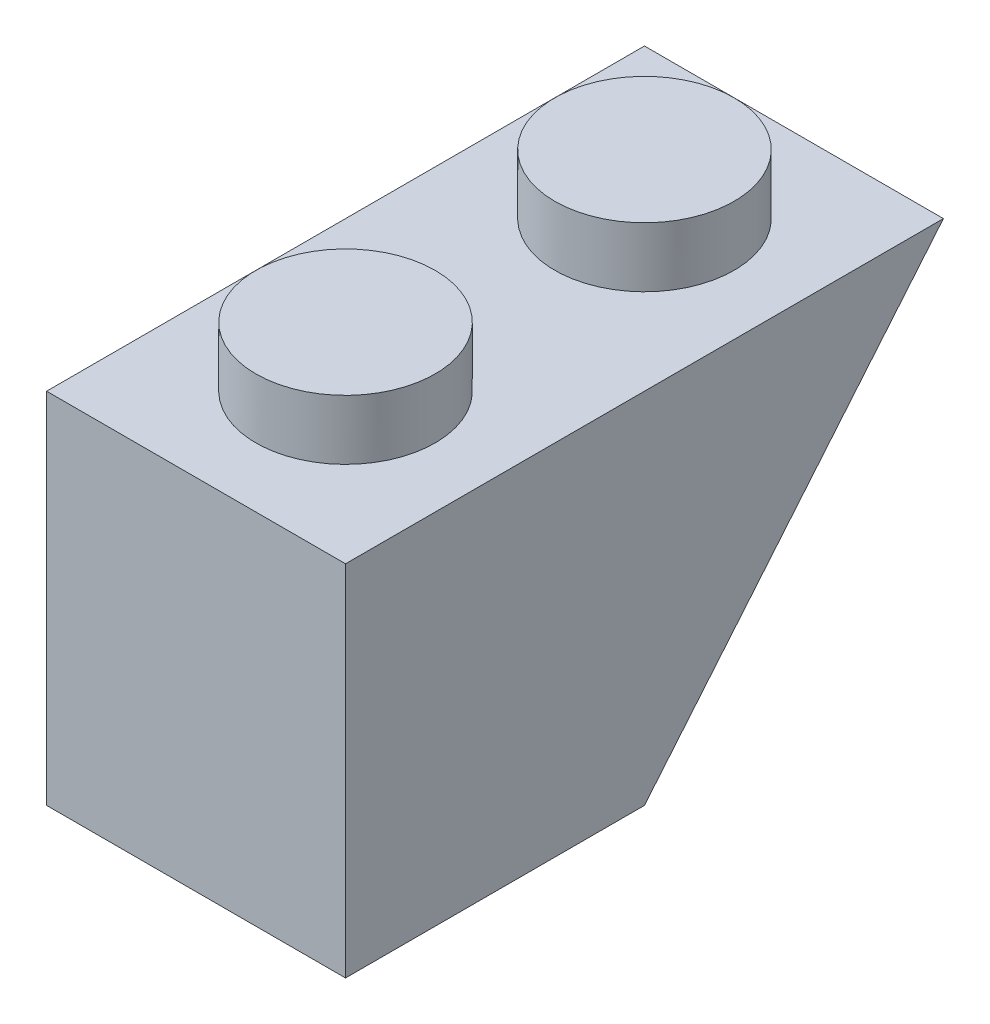
ISO-10303-21;
HEADER;
FILE_DESCRIPTION(('STEP AP214'),'2;1');
FILE_NAME('part.step','',(''),(''),'','','');
FILE_SCHEMA(('AUTOMOTIVE_DESIGN { 1 0 10303 214 1 1 1 1 }'));
ENDSEC;
DATA;
#1=APPLICATION_CONTEXT('core data for automotive mechanical design processes');
#2=APPLICATION_PROTOCOL_DEFINITION('international standard','automotive_design',2000,#1);
#3=PRODUCT_CONTEXT('',#1,'mechanical');
#4=PRODUCT('Part','Part','',(#3));
#5=PRODUCT_RELATED_PRODUCT_CATEGORY('part','',(#4));
#6=PRODUCT_DEFINITION_FORMATION('','',#4);
#7=PRODUCT_DEFINITION_CONTEXT('part definition',#1,'design');
#8=PRODUCT_DEFINITION('design','',#6,#7);
#9=PRODUCT_DEFINITION_SHAPE('','',#8);
#10=(LENGTH_UNIT() NAMED_UNIT(*) SI_UNIT(.MILLI.,.METRE.));
#11=(NAMED_UNIT(*) PLANE_ANGLE_UNIT() SI_UNIT($,.RADIAN.));
#12=(NAMED_UNIT(*) SI_UNIT($,.STERADIAN.) SOLID_ANGLE_UNIT());
#13=UNCERTAINTY_MEASURE_WITH_UNIT(LENGTH_MEASURE(1.E-05),#10,'distance_accuracy_value','');
#14=(GEOMETRIC_REPRESENTATION_CONTEXT(3) GLOBAL_UNCERTAINTY_ASSIGNED_CONTEXT((#13)) GLOBAL_UNIT_ASSIGNED_CONTEXT((#10,
#11,#12)) REPRESENTATION_CONTEXT('',''));
#15=CARTESIAN_POINT('',(0.,0.,0.));
#16=DIRECTION('',(0.,0.,1.));
#17=DIRECTION('',(1.,0.,0.));
#18=AXIS2_PLACEMENT_3D('',#15,#16,#17);
#19=CARTESIAN_POINT('',(8.,0.,0.));
#20=DIRECTION('',(0.,1.,0.));
#21=DIRECTION('',(0.,0.,1.));
#22=AXIS2_PLACEMENT_3D('',#19,#20,#21);
#23=PLANE('',#22);
#24=DIRECTION('',(0.,0.,-1.));
#25=VECTOR('',#24,1.);
#26=CARTESIAN_POINT('',(0.,0.,0.));
#27=LINE('',#26,#25);
#28=CARTESIAN_POINT('',(0.,0.,0.));
#29=VERTEX_POINT('',#28);
#30=CARTESIAN_POINT('',(0.,0.,-8.));
#31=VERTEX_POINT('',#30);
#32=EDGE_CURVE('E216',#29,#31,#27,.T.);
#33=ORIENTED_EDGE('',*,*,#32,.T.);
#34=DIRECTION('',(-1.,0.,0.));
#35=VECTOR('',#34,1.);
#36=CARTESIAN_POINT('',(8.,0.,-8.));
#37=LINE('',#36,#35);
#38=CARTESIAN_POINT('',(8.,0.,-8.));
#39=VERTEX_POINT('',#38);
#40=EDGE_CURVE('E229',#39,#31,#37,.T.);
#41=ORIENTED_EDGE('',*,*,#40,.F.);
#42=DIRECTION('',(0.,0.,-1.));
#43=VECTOR('',#42,1.);
#44=CARTESIAN_POINT('',(8.,0.,0.));
#45=LINE('',#44,#43);
#46=CARTESIAN_POINT('',(8.,0.,0.));
#47=VERTEX_POINT('',#46);
#48=EDGE_CURVE('E92',#47,#39,#45,.T.);
#49=ORIENTED_EDGE('',*,*,#48,.F.);
#50=DIRECTION('',(-1.,0.,0.));
#51=VECTOR('',#50,1.);
#52=CARTESIAN_POINT('',(8.,0.,0.));
#53=LINE('',#52,#51);
#54=EDGE_CURVE('E233',#47,#29,#53,.T.);
#55=ORIENTED_EDGE('',*,*,#54,.T.);
#56=EDGE_LOOP('',(#33,#41,#49,#55));
#57=FACE_BOUND('',#56,.T.);
#58=DIRECTION('',(0.,0.,-1.));
#59=VECTOR('',#58,1.);
#60=CARTESIAN_POINT('',(1.6,0.,0.));
#61=LINE('',#60,#59);
#62=CARTESIAN_POINT('',(1.6,0.,-1.6));
#63=VERTEX_POINT('',#62);
#64=CARTESIAN_POINT('',(1.6,0.,-5.91726675309156));
#65=VERTEX_POINT('',#64);
#66=EDGE_CURVE('E146',#63,#65,#61,.T.);
#67=ORIENTED_EDGE('',*,*,#66,.F.);
#68=DIRECTION('',(-1.,0.,0.));
#69=VECTOR('',#68,1.);
#70=CARTESIAN_POINT('',(8.,0.,-1.6));
#71=LINE('',#70,#69);
#72=CARTESIAN_POINT('',(6.4,0.,-1.6));
#73=VERTEX_POINT('',#72);
#74=EDGE_CURVE('E144',#73,#63,#71,.T.);
#75=ORIENTED_EDGE('',*,*,#74,.F.);
#76=DIRECTION('',(0.,0.,-1.));
#77=VECTOR('',#76,1.);
#78=CARTESIAN_POINT('',(6.4,0.,0.));
#79=LINE('',#78,#77);
#80=CARTESIAN_POINT('',(6.4,0.,-5.91726675309156));
#81=VERTEX_POINT('',#80);
#82=EDGE_CURVE('E157',#73,#81,#79,.T.);
#83=ORIENTED_EDGE('',*,*,#82,.T.);
#84=DIRECTION('',(-1.,0.,0.));
#85=VECTOR('',#84,1.);
#86=CARTESIAN_POINT('',(8.,0.,-5.91726675309156));
#87=LINE('',#86,#85);
#88=EDGE_CURVE('E175',#81,#65,#87,.T.);
#89=ORIENTED_EDGE('',*,*,#88,.T.);
#90=EDGE_LOOP('',(#67,#75,#83,#89));
#91=FACE_BOUND('',#90,.T.);
#92=ADVANCED_FACE('F38',(#57,#91),#23,.F.);
#93=CARTESIAN_POINT('',(8.,9.6,0.));
#94=DIRECTION('',(0.,0.,-1.));
#95=DIRECTION('',(0.,1.,0.));
#96=AXIS2_PLACEMENT_3D('',#93,#94,#95);
#97=PLANE('',#96);
#98=DIRECTION('',(0.,-1.,0.));
#99=VECTOR('',#98,1.);
#100=CARTESIAN_POINT('',(0.,9.6,0.));
#101=LINE('',#100,#99);
#102=CARTESIAN_POINT('',(0.,9.6,0.));
#103=VERTEX_POINT('',#102);
#104=EDGE_CURVE('E201',#103,#29,#101,.T.);
#105=ORIENTED_EDGE('',*,*,#104,.T.);
#106=ORIENTED_EDGE('',*,*,#54,.F.);
#107=DIRECTION('',(0.,-1.,0.));
#108=VECTOR('',#107,1.);
#109=CARTESIAN_POINT('',(8.,9.6,0.));
#110=LINE('',#109,#108);
#111=CARTESIAN_POINT('',(8.,9.6,0.));
#112=VERTEX_POINT('',#111);
#113=EDGE_CURVE('E202',#112,#47,#110,.T.);
#114=ORIENTED_EDGE('',*,*,#113,.F.);
#115=DIRECTION('',(-1.,0.,0.));
#116=VECTOR('',#115,1.);
#117=CARTESIAN_POINT('',(8.,9.6,0.));
#118=LINE('',#117,#116);
#119=EDGE_CURVE('E212',#112,#103,#118,.T.);
#120=ORIENTED_EDGE('',*,*,#119,.T.);
#121=EDGE_LOOP('',(#105,#106,#114,#120));
#122=FACE_BOUND('',#121,.T.);
#123=ADVANCED_FACE('F40',(#122),#97,.F.);
#124=CARTESIAN_POINT('',(8.,0.,-8.));
#125=DIRECTION('',(0.,0.64018439966448,0.768221279597376));
#126=DIRECTION('',(0.,-0.768221279597376,0.64018439966448));
#127=AXIS2_PLACEMENT_3D('',#124,#125,#126);
#128=PLANE('',#127);
#129=DIRECTION('',(0.,0.768221279597376,-0.64018439966448));
#130=VECTOR('',#129,1.);
#131=CARTESIAN_POINT('',(0.,0.,-8.));
#132=LINE('',#131,#130);
#133=CARTESIAN_POINT('',(0.,9.6,-16.));
#134=VERTEX_POINT('',#133);
#135=EDGE_CURVE('E219',#31,#134,#132,.T.);
#136=ORIENTED_EDGE('',*,*,#135,.T.);
#137=DIRECTION('',(-1.,0.,0.));
#138=VECTOR('',#137,1.);
#139=CARTESIAN_POINT('',(8.,9.6,-16.));
#140=LINE('',#139,#138);
#141=CARTESIAN_POINT('',(8.,9.6,-16.));
#142=VERTEX_POINT('',#141);
#143=EDGE_CURVE('E226',#142,#134,#140,.T.);
#144=ORIENTED_EDGE('',*,*,#143,.F.);
#145=DIRECTION('',(0.,0.768221279597376,-0.64018439966448));
#146=VECTOR('',#145,1.);
#147=CARTESIAN_POINT('',(8.,0.,-8.));
#148=LINE('',#147,#146);
#149=EDGE_CURVE('E207',#39,#142,#148,.T.);
#150=ORIENTED_EDGE('',*,*,#149,.F.);
#151=ORIENTED_EDGE('',*,*,#40,.T.);
#152=EDGE_LOOP('',(#136,#144,#150,#151));
#153=FACE_BOUND('',#152,.T.);
#154=ADVANCED_FACE('F244',(#153),#128,.F.);
#155=CARTESIAN_POINT('',(8.,9.6,-16.));
#156=DIRECTION('',(0.,-1.,0.));
#157=DIRECTION('',(0.,0.,-1.));
#158=AXIS2_PLACEMENT_3D('',#155,#156,#157);
#159=PLANE('',#158);
#160=CARTESIAN_POINT('',(4.,9.6,-12.));
#161=DIRECTION('',(0.,-1.,0.));
#162=DIRECTION('',(0.,0.,-1.));
#163=AXIS2_PLACEMENT_3D('',#160,#161,#162);
#164=CIRCLE('',#163,2.4);
#165=CARTESIAN_POINT('',(4.,9.6,-14.4));
#166=VERTEX_POINT('',#165);
#167=EDGE_CURVE('E11',#166,#166,#164,.F.);
#168=ORIENTED_EDGE('',*,*,#167,.F.);
#169=EDGE_LOOP('',(#168));
#170=FACE_BOUND('',#169,.T.);
#171=CARTESIAN_POINT('',(4.,9.6,-4.));
#172=DIRECTION('',(0.,-1.,0.));
#173=DIRECTION('',(0.,0.,-1.));
#174=AXIS2_PLACEMENT_3D('',#171,#172,#173);
#175=CIRCLE('',#174,2.4);
#176=CARTESIAN_POINT('',(4.,9.6,-6.39999999999999));
#177=VERTEX_POINT('',#176);
#178=EDGE_CURVE('E47',#177,#177,#175,.F.);
#179=ORIENTED_EDGE('',*,*,#178,.F.);
#180=EDGE_LOOP('',(#179));
#181=FACE_BOUND('',#180,.T.);
#182=DIRECTION('',(0.,0.,1.));
#183=VECTOR('',#182,1.);
#184=CARTESIAN_POINT('',(0.,9.6,-16.));
#185=LINE('',#184,#183);
#186=EDGE_CURVE('E84',#134,#103,#185,.T.);
#187=ORIENTED_EDGE('',*,*,#186,.T.);
#188=ORIENTED_EDGE('',*,*,#119,.F.);
#189=DIRECTION('',(0.,0.,1.));
#190=VECTOR('',#189,1.);
#191=CARTESIAN_POINT('',(8.,9.6,-16.));
#192=LINE('',#191,#190);
#193=EDGE_CURVE('E63',#142,#112,#192,.T.);
#194=ORIENTED_EDGE('',*,*,#193,.F.);
#195=ORIENTED_EDGE('',*,*,#143,.T.);
#196=EDGE_LOOP('',(#187,#188,#194,#195));
#197=FACE_BOUND('',#196,.T.);
#198=ADVANCED_FACE('F241',(#170,#181,#197),#159,.F.);
#199=CARTESIAN_POINT('',(8.,0.,0.));
#200=DIRECTION('',(1.,0.,0.));
#201=DIRECTION('',(0.,0.,-1.));
#202=AXIS2_PLACEMENT_3D('',#199,#200,#201);
#203=PLANE('',#202);
#204=ORIENTED_EDGE('',*,*,#113,.T.);
#205=ORIENTED_EDGE('',*,*,#48,.T.);
#206=ORIENTED_EDGE('',*,*,#149,.T.);
#207=ORIENTED_EDGE('',*,*,#193,.T.);
#208=EDGE_LOOP('',(#204,#205,#206,#207));
#209=FACE_BOUND('',#208,.T.);
#210=ADVANCED_FACE('F243',(#209),#203,.T.);
#211=CARTESIAN_POINT('',(0.,0.,0.));
#212=DIRECTION('',(1.,0.,0.));
#213=DIRECTION('',(0.,0.,-1.));
#214=AXIS2_PLACEMENT_3D('',#211,#212,#213);
#215=PLANE('',#214);
#216=ORIENTED_EDGE('',*,*,#104,.F.);
#217=ORIENTED_EDGE('',*,*,#186,.F.);
#218=ORIENTED_EDGE('',*,*,#135,.F.);
#219=ORIENTED_EDGE('',*,*,#32,.F.);
#220=EDGE_LOOP('',(#216,#217,#218,#219));
#221=FACE_BOUND('',#220,.T.);
#222=ADVANCED_FACE('F251',(#221),#215,.F.);
#223=CARTESIAN_POINT('',(4.,11.2,-3.99999999999999));
#224=DIRECTION('',(0.,-1.,0.));
#225=DIRECTION('',(0.,0.,-1.));
#226=AXIS2_PLACEMENT_3D('',#223,#224,#225);
#227=CYLINDRICAL_SURFACE('',#226,2.4);
#228=CARTESIAN_POINT('',(4.,11.2,-3.99999999999999));
#229=DIRECTION('',(0.,1.,0.));
#230=DIRECTION('',(0.,0.,1.));
#231=AXIS2_PLACEMENT_3D('',#228,#229,#230);
#232=CIRCLE('',#231,2.4);
#233=CARTESIAN_POINT('',(4.,11.2,-1.6));
#234=VERTEX_POINT('',#233);
#235=EDGE_CURVE('E197',#234,#234,#232,.T.);
#236=ORIENTED_EDGE('',*,*,#235,.F.);
#237=EDGE_LOOP('',(#236));
#238=FACE_BOUND('',#237,.T.);
#239=ORIENTED_EDGE('',*,*,#178,.T.);
#240=EDGE_LOOP('',(#239));
#241=FACE_BOUND('',#240,.T.);
#242=ADVANCED_FACE('F239',(#238,#241),#227,.T.);
#243=CARTESIAN_POINT('',(4.,11.2,-3.99999999999999));
#244=DIRECTION('',(0.,1.,0.));
#245=DIRECTION('',(0.,0.,1.));
#246=AXIS2_PLACEMENT_3D('',#243,#244,#245);
#247=PLANE('',#246);
#248=ORIENTED_EDGE('',*,*,#235,.T.);
#249=EDGE_LOOP('',(#248));
#250=FACE_BOUND('',#249,.T.);
#251=ADVANCED_FACE('F295',(#250),#247,.T.);
#252=CARTESIAN_POINT('',(4.,11.2,-12.));
#253=DIRECTION('',(0.,-1.,0.));
#254=DIRECTION('',(0.,0.,-1.));
#255=AXIS2_PLACEMENT_3D('',#252,#253,#254);
#256=CYLINDRICAL_SURFACE('',#255,2.4);
#257=CARTESIAN_POINT('',(4.,11.2,-12.));
#258=DIRECTION('',(0.,1.,0.));
#259=DIRECTION('',(0.,0.,1.));
#260=AXIS2_PLACEMENT_3D('',#257,#258,#259);
#261=CIRCLE('',#260,2.4);
#262=CARTESIAN_POINT('',(4.,11.2,-9.6));
#263=VERTEX_POINT('',#262);
#264=EDGE_CURVE('E193',#263,#263,#261,.T.);
#265=ORIENTED_EDGE('',*,*,#264,.F.);
#266=EDGE_LOOP('',(#265));
#267=FACE_BOUND('',#266,.T.);
#268=ORIENTED_EDGE('',*,*,#167,.T.);
#269=EDGE_LOOP('',(#268));
#270=FACE_BOUND('',#269,.T.);
#271=ADVANCED_FACE('F291',(#267,#270),#256,.T.);
#272=CARTESIAN_POINT('',(4.,11.2,-12.));
#273=DIRECTION('',(0.,1.,0.));
#274=DIRECTION('',(0.,0.,1.));
#275=AXIS2_PLACEMENT_3D('',#272,#273,#274);
#276=PLANE('',#275);
#277=ORIENTED_EDGE('',*,*,#264,.T.);
#278=EDGE_LOOP('',(#277));
#279=FACE_BOUND('',#278,.T.);
#280=ADVANCED_FACE('F288',(#279),#276,.T.);
#281=CARTESIAN_POINT('',(8.,9.6,-1.6));
#282=DIRECTION('',(0.,0.,-1.));
#283=DIRECTION('',(0.,1.,0.));
#284=AXIS2_PLACEMENT_3D('',#281,#282,#283);
#285=PLANE('',#284);
#286=DIRECTION('',(0.,-1.,0.));
#287=VECTOR('',#286,1.);
#288=CARTESIAN_POINT('',(1.6,9.6,-1.6));
#289=LINE('',#288,#287);
#290=CARTESIAN_POINT('',(1.6,8.,-1.6));
#291=VERTEX_POINT('',#290);
#292=EDGE_CURVE('E126',#291,#63,#289,.T.);
#293=ORIENTED_EDGE('',*,*,#292,.F.);
#294=DIRECTION('',(-1.,0.,0.));
#295=VECTOR('',#294,1.);
#296=CARTESIAN_POINT('',(8.,8.,-1.6));
#297=LINE('',#296,#295);
#298=CARTESIAN_POINT('',(6.4,8.,-1.6));
#299=VERTEX_POINT('',#298);
#300=EDGE_CURVE('E134',#299,#291,#297,.T.);
#301=ORIENTED_EDGE('',*,*,#300,.F.);
#302=DIRECTION('',(0.,-1.,0.));
#303=VECTOR('',#302,1.);
#304=CARTESIAN_POINT('',(6.4,9.6,-1.6));
#305=LINE('',#304,#303);
#306=EDGE_CURVE('E54',#299,#73,#305,.T.);
#307=ORIENTED_EDGE('',*,*,#306,.T.);
#308=ORIENTED_EDGE('',*,*,#74,.T.);
#309=EDGE_LOOP('',(#293,#301,#307,#308));
#310=FACE_BOUND('',#309,.T.);
#311=ADVANCED_FACE('F142',(#310),#285,.T.);
#312=CARTESIAN_POINT('',(8.,1.02429503946317,-6.7708459526442));
#313=DIRECTION('',(0.,0.64018439966448,0.768221279597376));
#314=DIRECTION('',(0.,-0.768221279597376,0.64018439966448));
#315=AXIS2_PLACEMENT_3D('',#312,#313,#314);
#316=PLANE('',#315);
#317=DIRECTION('',(0.,0.768221279597376,-0.64018439966448));
#318=VECTOR('',#317,1.);
#319=CARTESIAN_POINT('',(1.6,1.02429503946317,-6.7708459526442));
#320=LINE('',#319,#318);
#321=CARTESIAN_POINT('',(1.6,8.,-12.5839334197582));
#322=VERTEX_POINT('',#321);
#323=EDGE_CURVE('E129',#65,#322,#320,.T.);
#324=ORIENTED_EDGE('',*,*,#323,.F.);
#325=ORIENTED_EDGE('',*,*,#88,.F.);
#326=DIRECTION('',(0.,0.768221279597376,-0.64018439966448));
#327=VECTOR('',#326,1.);
#328=CARTESIAN_POINT('',(6.4,1.02429503946317,-6.7708459526442));
#329=LINE('',#328,#327);
#330=CARTESIAN_POINT('',(6.4,8.,-12.5839334197582));
#331=VERTEX_POINT('',#330);
#332=EDGE_CURVE('E170',#81,#331,#329,.T.);
#333=ORIENTED_EDGE('',*,*,#332,.T.);
#334=DIRECTION('',(-1.,0.,0.));
#335=VECTOR('',#334,1.);
#336=CARTESIAN_POINT('',(8.,8.,-12.5839334197582));
#337=LINE('',#336,#335);
#338=CARTESIAN_POINT('',(4.54682882265793,8.,-12.5839334197582));
#339=VERTEX_POINT('',#338);
#340=EDGE_CURVE('E171',#331,#339,#337,.T.);
#341=ORIENTED_EDGE('',*,*,#340,.T.);
#342=CARTESIAN_POINT('',(4.,7.29927989629013,-12.));
#343=DIRECTION('',(0.,0.64018439966448,0.768221279597376));
#344=DIRECTION('',(0.,-0.768221279597376,0.64018439966448));
#345=AXIS2_PLACEMENT_3D('',#342,#343,#344);
#346=ELLIPSE('',#345,1.24963994814506,0.799999999999999);
#347=CARTESIAN_POINT('',(3.45317117734207,8.,-12.5839334197582));
#348=VERTEX_POINT('',#347);
#349=EDGE_CURVE('E163',#348,#339,#346,.F.);
#350=ORIENTED_EDGE('',*,*,#349,.F.);
#351=EDGE_CURVE('E140',#348,#322,#337,.T.);
#352=ORIENTED_EDGE('',*,*,#351,.T.);
#353=EDGE_LOOP('',(#324,#325,#333,#341,#350,#352));
#354=FACE_BOUND('',#353,.T.);
#355=ADVANCED_FACE('F266',(#354),#316,.T.);
#356=CARTESIAN_POINT('',(8.,8.,-16.));
#357=DIRECTION('',(0.,-1.,0.));
#358=DIRECTION('',(0.,0.,-1.));
#359=AXIS2_PLACEMENT_3D('',#356,#357,#358);
#360=PLANE('',#359);
#361=CARTESIAN_POINT('',(4.,8.,-4.));
#362=DIRECTION('',(0.,-1.,0.));
#363=DIRECTION('',(0.,0.,-1.));
#364=AXIS2_PLACEMENT_3D('',#361,#362,#363);
#365=CIRCLE('',#364,0.799999999999999);
#366=CARTESIAN_POINT('',(4.,8.,-4.79999999999999));
#367=VERTEX_POINT('',#366);
#368=EDGE_CURVE('E164',#367,#367,#365,.F.);
#369=ORIENTED_EDGE('',*,*,#368,.T.);
#370=EDGE_LOOP('',(#369));
#371=FACE_BOUND('',#370,.T.);
#372=DIRECTION('',(0.,0.,1.));
#373=VECTOR('',#372,1.);
#374=CARTESIAN_POINT('',(1.6,8.,-16.));
#375=LINE('',#374,#373);
#376=EDGE_CURVE('E122',#322,#291,#375,.T.);
#377=ORIENTED_EDGE('',*,*,#376,.F.);
#378=ORIENTED_EDGE('',*,*,#351,.F.);
#379=CARTESIAN_POINT('',(4.,8.,-12.));
#380=DIRECTION('',(0.,-1.,0.));
#381=DIRECTION('',(0.,0.,-1.));
#382=AXIS2_PLACEMENT_3D('',#379,#380,#381);
#383=CIRCLE('',#382,0.799999999999999);
#384=EDGE_CURVE('E159',#348,#339,#383,.F.);
#385=ORIENTED_EDGE('',*,*,#384,.T.);
#386=ORIENTED_EDGE('',*,*,#340,.F.);
#387=DIRECTION('',(0.,0.,1.));
#388=VECTOR('',#387,1.);
#389=CARTESIAN_POINT('',(6.4,8.,-16.));
#390=LINE('',#389,#388);
#391=EDGE_CURVE('E138',#331,#299,#390,.T.);
#392=ORIENTED_EDGE('',*,*,#391,.T.);
#393=ORIENTED_EDGE('',*,*,#300,.T.);
#394=EDGE_LOOP('',(#377,#378,#385,#386,#392,#393));
#395=FACE_BOUND('',#394,.T.);
#396=ADVANCED_FACE('F135',(#371,#395),#360,.T.);
#397=CARTESIAN_POINT('',(6.4,0.,0.));
#398=DIRECTION('',(1.,0.,0.));
#399=DIRECTION('',(0.,0.,-1.));
#400=AXIS2_PLACEMENT_3D('',#397,#398,#399);
#401=PLANE('',#400);
#402=ORIENTED_EDGE('',*,*,#306,.F.);
#403=ORIENTED_EDGE('',*,*,#391,.F.);
#404=ORIENTED_EDGE('',*,*,#332,.F.);
#405=ORIENTED_EDGE('',*,*,#82,.F.);
#406=EDGE_LOOP('',(#402,#403,#404,#405));
#407=FACE_BOUND('',#406,.T.);
#408=ADVANCED_FACE('F353',(#407),#401,.F.);
#409=CARTESIAN_POINT('',(1.6,0.,0.));
#410=DIRECTION('',(1.,0.,0.));
#411=DIRECTION('',(0.,0.,-1.));
#412=AXIS2_PLACEMENT_3D('',#409,#410,#411);
#413=PLANE('',#412);
#414=ORIENTED_EDGE('',*,*,#292,.T.);
#415=ORIENTED_EDGE('',*,*,#66,.T.);
#416=ORIENTED_EDGE('',*,*,#323,.T.);
#417=ORIENTED_EDGE('',*,*,#376,.T.);
#418=EDGE_LOOP('',(#414,#415,#416,#417));
#419=FACE_BOUND('',#418,.T.);
#420=ADVANCED_FACE('F124',(#419),#413,.T.);
#421=CARTESIAN_POINT('',(4.,11.2,-3.99999999999999));
#422=DIRECTION('',(0.,-1.,0.));
#423=DIRECTION('',(0.,0.,-1.));
#424=AXIS2_PLACEMENT_3D('',#421,#422,#423);
#425=CYLINDRICAL_SURFACE('',#424,0.799999999999999);
#426=CARTESIAN_POINT('',(4.,9.6,-4.));
#427=DIRECTION('',(0.,1.,0.));
#428=DIRECTION('',(0.,0.,1.));
#429=AXIS2_PLACEMENT_3D('',#426,#427,#428);
#430=CIRCLE('',#429,0.799999999999999);
#431=CARTESIAN_POINT('',(4.,9.6,-3.2));
#432=VERTEX_POINT('',#431);
#433=EDGE_CURVE('E147',#432,#432,#430,.T.);
#434=ORIENTED_EDGE('',*,*,#433,.T.);
#435=EDGE_LOOP('',(#434));
#436=FACE_BOUND('',#435,.T.);
#437=ORIENTED_EDGE('',*,*,#368,.F.);
#438=EDGE_LOOP('',(#437));
#439=FACE_BOUND('',#438,.T.);
#440=ADVANCED_FACE('F283',(#436,#439),#425,.F.);
#441=CARTESIAN_POINT('',(4.,9.6,-4.));
#442=DIRECTION('',(0.,1.,0.));
#443=DIRECTION('',(0.,0.,1.));
#444=AXIS2_PLACEMENT_3D('',#441,#442,#443);
#445=PLANE('',#444);
#446=ORIENTED_EDGE('',*,*,#433,.F.);
#447=EDGE_LOOP('',(#446));
#448=FACE_BOUND('',#447,.T.);
#449=ADVANCED_FACE('F274',(#448),#445,.F.);
#450=CARTESIAN_POINT('',(4.,11.2,-12.));
#451=DIRECTION('',(0.,-1.,0.));
#452=DIRECTION('',(0.,0.,-1.));
#453=AXIS2_PLACEMENT_3D('',#450,#451,#452);
#454=CYLINDRICAL_SURFACE('',#453,0.799999999999999);
#455=CARTESIAN_POINT('',(4.,9.6,-12.));
#456=DIRECTION('',(0.,1.,0.));
#457=DIRECTION('',(0.,0.,1.));
#458=AXIS2_PLACEMENT_3D('',#455,#456,#457);
#459=CIRCLE('',#458,0.799999999999999);
#460=CARTESIAN_POINT('',(4.,9.6,-11.2));
#461=VERTEX_POINT('',#460);
#462=EDGE_CURVE('E153',#461,#461,#459,.T.);
#463=ORIENTED_EDGE('',*,*,#462,.T.);
#464=EDGE_LOOP('',(#463));
#465=FACE_BOUND('',#464,.T.);
#466=ORIENTED_EDGE('',*,*,#384,.F.);
#467=ORIENTED_EDGE('',*,*,#349,.T.);
#468=EDGE_LOOP('',(#466,#467));
#469=FACE_BOUND('',#468,.T.);
#470=ADVANCED_FACE('F271',(#465,#469),#454,.F.);
#471=CARTESIAN_POINT('',(4.,9.6,-12.));
#472=DIRECTION('',(0.,1.,0.));
#473=DIRECTION('',(0.,0.,1.));
#474=AXIS2_PLACEMENT_3D('',#471,#472,#473);
#475=PLANE('',#474);
#476=ORIENTED_EDGE('',*,*,#462,.F.);
#477=EDGE_LOOP('',(#476));
#478=FACE_BOUND('',#477,.T.);
#479=ADVANCED_FACE('F273',(#478),#475,.F.);
#480=CLOSED_SHELL('',(#92,#123,#154,#198,#210,#222,#242,#251,#271,#280,#311,#355,#396,#408,#420,
#440,#449,#470,#479));
#481=MANIFOLD_SOLID_BREP('B2',#480);
#482=ADVANCED_BREP_SHAPE_REPRESENTATION('',(#18,#481),#14);
#483=SHAPE_DEFINITION_REPRESENTATION(#9,#482);
ENDSEC;
END-ISO-10303-21;
